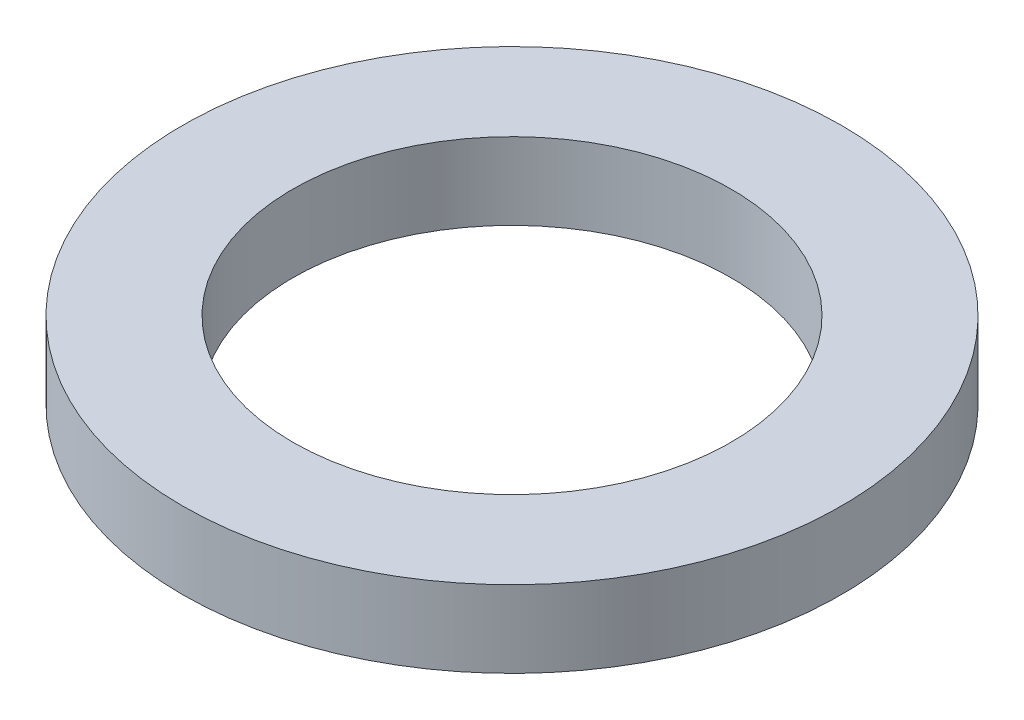
ISO-10303-21;
HEADER;
FILE_DESCRIPTION(('STEP AP214'),'2;1');
FILE_NAME('part.step','',(''),(''),'','','');
FILE_SCHEMA(('AUTOMOTIVE_DESIGN { 1 0 10303 214 1 1 1 1 }'));
ENDSEC;
DATA;
#1=APPLICATION_CONTEXT('core data for automotive mechanical design processes');
#2=APPLICATION_PROTOCOL_DEFINITION('international standard','automotive_design',2000,#1);
#3=PRODUCT_CONTEXT('',#1,'mechanical');
#4=PRODUCT('Part','Part','',(#3));
#5=PRODUCT_RELATED_PRODUCT_CATEGORY('part','',(#4));
#6=PRODUCT_DEFINITION_FORMATION('','',#4);
#7=PRODUCT_DEFINITION_CONTEXT('part definition',#1,'design');
#8=PRODUCT_DEFINITION('design','',#6,#7);
#9=PRODUCT_DEFINITION_SHAPE('','',#8);
#10=(LENGTH_UNIT() NAMED_UNIT(*) SI_UNIT(.MILLI.,.METRE.));
#11=(NAMED_UNIT(*) PLANE_ANGLE_UNIT() SI_UNIT($,.RADIAN.));
#12=(NAMED_UNIT(*) SI_UNIT($,.STERADIAN.) SOLID_ANGLE_UNIT());
#13=UNCERTAINTY_MEASURE_WITH_UNIT(LENGTH_MEASURE(1.E-05),#10,'distance_accuracy_value','');
#14=(GEOMETRIC_REPRESENTATION_CONTEXT(3) GLOBAL_UNCERTAINTY_ASSIGNED_CONTEXT((#13)) GLOBAL_UNIT_ASSIGNED_CONTEXT((#10,
#11,#12)) REPRESENTATION_CONTEXT('',''));
#15=CARTESIAN_POINT('',(0.,0.,0.));
#16=DIRECTION('',(0.,0.,1.));
#17=DIRECTION('',(1.,0.,0.));
#18=AXIS2_PLACEMENT_3D('',#15,#16,#17);
#19=CARTESIAN_POINT('',(0.,22.7096404931965,0.));
#20=DIRECTION('',(0.,1.,0.));
#21=DIRECTION('',(0.,0.,1.));
#22=AXIS2_PLACEMENT_3D('',#19,#20,#21);
#23=CYLINDRICAL_SURFACE('',#22,27.178);
#24=CARTESIAN_POINT('',(0.,-9.525,0.));
#25=DIRECTION('',(0.,1.,0.));
#26=DIRECTION('',(0.,0.,1.));
#27=AXIS2_PLACEMENT_3D('',#24,#25,#26);
#28=CIRCLE('',#27,27.178);
#29=CARTESIAN_POINT('',(0.,-9.525,27.178));
#30=VERTEX_POINT('',#29);
#31=EDGE_CURVE('E49',#30,#30,#28,.T.);
#32=ORIENTED_EDGE('',*,*,#31,.F.);
#33=EDGE_LOOP('',(#32));
#34=FACE_BOUND('',#33,.T.);
#35=CARTESIAN_POINT('',(0.,0.,0.));
#36=DIRECTION('',(0.,1.,0.));
#37=DIRECTION('',(0.,0.,1.));
#38=AXIS2_PLACEMENT_3D('',#35,#36,#37);
#39=CIRCLE('',#38,27.178);
#40=CARTESIAN_POINT('',(0.,0.,27.178));
#41=VERTEX_POINT('',#40);
#42=EDGE_CURVE('E10',#41,#41,#39,.T.);
#43=ORIENTED_EDGE('',*,*,#42,.T.);
#44=EDGE_LOOP('',(#43));
#45=FACE_BOUND('',#44,.T.);
#46=ADVANCED_FACE('F35',(#34,#45),#23,.F.);
#47=CARTESIAN_POINT('',(27.178,0.,0.));
#48=DIRECTION('',(0.,-1.,0.));
#49=DIRECTION('',(0.,0.,-1.));
#50=AXIS2_PLACEMENT_3D('',#47,#48,#49);
#51=PLANE('',#50);
#52=ORIENTED_EDGE('',*,*,#42,.F.);
#53=EDGE_LOOP('',(#52));
#54=FACE_BOUND('',#53,.T.);
#55=CARTESIAN_POINT('',(0.,0.,0.));
#56=DIRECTION('',(0.,1.,0.));
#57=DIRECTION('',(0.,0.,1.));
#58=AXIS2_PLACEMENT_3D('',#55,#56,#57);
#59=CIRCLE('',#58,40.8559);
#60=CARTESIAN_POINT('',(0.,0.,40.8559));
#61=VERTEX_POINT('',#60);
#62=EDGE_CURVE('E41',#61,#61,#59,.T.);
#63=ORIENTED_EDGE('',*,*,#62,.T.);
#64=EDGE_LOOP('',(#63));
#65=FACE_BOUND('',#64,.T.);
#66=ADVANCED_FACE('F58',(#54,#65),#51,.F.);
#67=CARTESIAN_POINT('',(0.,22.7096404931965,0.));
#68=DIRECTION('',(0.,1.,0.));
#69=DIRECTION('',(0.,0.,1.));
#70=AXIS2_PLACEMENT_3D('',#67,#68,#69);
#71=CYLINDRICAL_SURFACE('',#70,40.8559);
#72=ORIENTED_EDGE('',*,*,#62,.F.);
#73=EDGE_LOOP('',(#72));
#74=FACE_BOUND('',#73,.T.);
#75=CARTESIAN_POINT('',(0.,-9.525,0.));
#76=DIRECTION('',(0.,1.,0.));
#77=DIRECTION('',(0.,0.,1.));
#78=AXIS2_PLACEMENT_3D('',#75,#76,#77);
#79=CIRCLE('',#78,40.8559);
#80=CARTESIAN_POINT('',(0.,-9.525,40.8559));
#81=VERTEX_POINT('',#80);
#82=EDGE_CURVE('E45',#81,#81,#79,.T.);
#83=ORIENTED_EDGE('',*,*,#82,.T.);
#84=EDGE_LOOP('',(#83));
#85=FACE_BOUND('',#84,.T.);
#86=ADVANCED_FACE('F62',(#74,#85),#71,.T.);
#87=CARTESIAN_POINT('',(27.178,-9.525,0.));
#88=DIRECTION('',(0.,1.,0.));
#89=DIRECTION('',(0.,0.,1.));
#90=AXIS2_PLACEMENT_3D('',#87,#88,#89);
#91=PLANE('',#90);
#92=ORIENTED_EDGE('',*,*,#82,.F.);
#93=EDGE_LOOP('',(#92));
#94=FACE_BOUND('',#93,.T.);
#95=ORIENTED_EDGE('',*,*,#31,.T.);
#96=EDGE_LOOP('',(#95));
#97=FACE_BOUND('',#96,.T.);
#98=ADVANCED_FACE('F55',(#94,#97),#91,.F.);
#99=CLOSED_SHELL('',(#46,#66,#86,#98));
#100=MANIFOLD_SOLID_BREP('B2',#99);
#101=ADVANCED_BREP_SHAPE_REPRESENTATION('',(#18,#100),#14);
#102=SHAPE_DEFINITION_REPRESENTATION(#9,#101);
ENDSEC;
END-ISO-10303-21;
